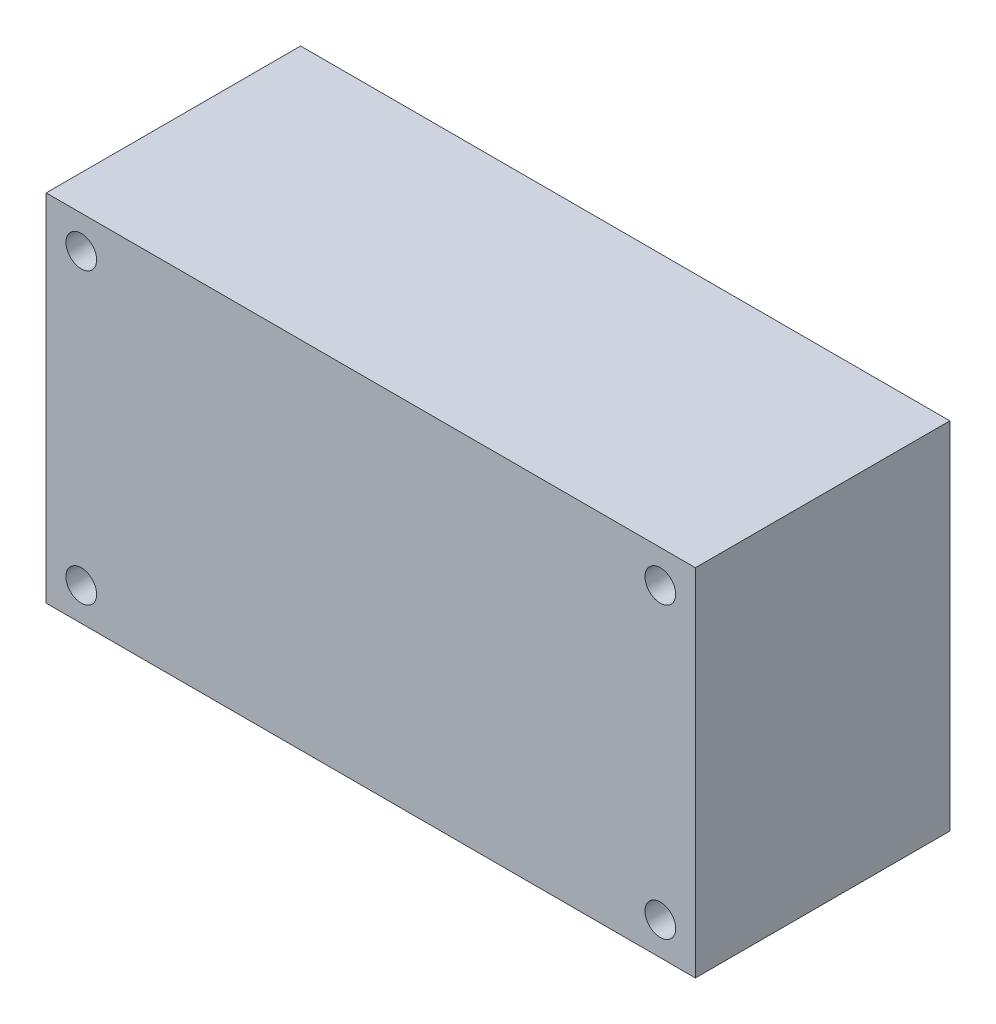
ISO-10303-21;
HEADER;
FILE_DESCRIPTION(('STEP AP214'),'2;1');
FILE_NAME('part.step','',(''),(''),'','','');
FILE_SCHEMA(('AUTOMOTIVE_DESIGN { 1 0 10303 214 1 1 1 1 }'));
ENDSEC;
DATA;
#1=APPLICATION_CONTEXT('core data for automotive mechanical design processes');
#2=APPLICATION_PROTOCOL_DEFINITION('international standard','automotive_design',2000,#1);
#3=PRODUCT_CONTEXT('',#1,'mechanical');
#4=PRODUCT('Part','Part','',(#3));
#5=PRODUCT_RELATED_PRODUCT_CATEGORY('part','',(#4));
#6=PRODUCT_DEFINITION_FORMATION('','',#4);
#7=PRODUCT_DEFINITION_CONTEXT('part definition',#1,'design');
#8=PRODUCT_DEFINITION('design','',#6,#7);
#9=PRODUCT_DEFINITION_SHAPE('','',#8);
#10=(LENGTH_UNIT() NAMED_UNIT(*) SI_UNIT(.MILLI.,.METRE.));
#11=(NAMED_UNIT(*) PLANE_ANGLE_UNIT() SI_UNIT($,.RADIAN.));
#12=(NAMED_UNIT(*) SI_UNIT($,.STERADIAN.) SOLID_ANGLE_UNIT());
#13=UNCERTAINTY_MEASURE_WITH_UNIT(LENGTH_MEASURE(1.E-05),#10,'distance_accuracy_value','');
#14=(GEOMETRIC_REPRESENTATION_CONTEXT(3) GLOBAL_UNCERTAINTY_ASSIGNED_CONTEXT((#13)) GLOBAL_UNIT_ASSIGNED_CONTEXT((#10,
#11,#12)) REPRESENTATION_CONTEXT('',''));
#15=CARTESIAN_POINT('',(0.,0.,0.));
#16=DIRECTION('',(0.,0.,1.));
#17=DIRECTION('',(1.,0.,0.));
#18=AXIS2_PLACEMENT_3D('',#15,#16,#17);
#19=CARTESIAN_POINT('',(37.,-20.25,29.));
#20=DIRECTION('',(0.,0.,1.));
#21=DIRECTION('',(1.,0.,0.));
#22=AXIS2_PLACEMENT_3D('',#19,#20,#21);
#23=PLANE('',#22);
#24=CARTESIAN_POINT('',(33.,-16.5,29.));
#25=DIRECTION('',(0.,0.,1.));
#26=DIRECTION('',(1.,0.,0.));
#27=AXIS2_PLACEMENT_3D('',#24,#25,#26);
#28=CIRCLE('',#27,1.75);
#29=CARTESIAN_POINT('',(31.25,-16.5,29.));
#30=VERTEX_POINT('',#29);
#31=EDGE_CURVE('E119',#30,#30,#28,.T.);
#32=ORIENTED_EDGE('',*,*,#31,.F.);
#33=EDGE_LOOP('',(#32));
#34=FACE_BOUND('',#33,.T.);
#35=CARTESIAN_POINT('',(-33.,16.5,29.));
#36=DIRECTION('',(0.,0.,1.));
#37=DIRECTION('',(1.,0.,0.));
#38=AXIS2_PLACEMENT_3D('',#35,#36,#37);
#39=CIRCLE('',#38,1.75);
#40=CARTESIAN_POINT('',(-34.75,16.5,29.));
#41=VERTEX_POINT('',#40);
#42=EDGE_CURVE('E98',#41,#41,#39,.T.);
#43=ORIENTED_EDGE('',*,*,#42,.F.);
#44=EDGE_LOOP('',(#43));
#45=FACE_BOUND('',#44,.T.);
#46=DIRECTION('',(0.,1.,0.));
#47=VECTOR('',#46,1.);
#48=CARTESIAN_POINT('',(37.,20.25,29.));
#49=LINE('',#48,#47);
#50=CARTESIAN_POINT('',(37.,-20.25,29.));
#51=VERTEX_POINT('',#50);
#52=CARTESIAN_POINT('',(37.,20.25,29.));
#53=VERTEX_POINT('',#52);
#54=EDGE_CURVE('E83',#51,#53,#49,.T.);
#55=ORIENTED_EDGE('',*,*,#54,.T.);
#56=DIRECTION('',(-1.,0.,0.));
#57=VECTOR('',#56,1.);
#58=CARTESIAN_POINT('',(-37.,20.25,29.));
#59=LINE('',#58,#57);
#60=CARTESIAN_POINT('',(-37.,20.25,29.));
#61=VERTEX_POINT('',#60);
#62=EDGE_CURVE('E78',#53,#61,#59,.T.);
#63=ORIENTED_EDGE('',*,*,#62,.T.);
#64=DIRECTION('',(0.,-1.,0.));
#65=VECTOR('',#64,1.);
#66=CARTESIAN_POINT('',(-37.,20.25,29.));
#67=LINE('',#66,#65);
#68=CARTESIAN_POINT('',(-37.,-20.25,29.));
#69=VERTEX_POINT('',#68);
#70=EDGE_CURVE('E81',#61,#69,#67,.T.);
#71=ORIENTED_EDGE('',*,*,#70,.T.);
#72=DIRECTION('',(1.,0.,0.));
#73=VECTOR('',#72,1.);
#74=CARTESIAN_POINT('',(-37.,-20.25,29.));
#75=LINE('',#74,#73);
#76=EDGE_CURVE('E48',#69,#51,#75,.T.);
#77=ORIENTED_EDGE('',*,*,#76,.T.);
#78=EDGE_LOOP('',(#55,#63,#71,#77));
#79=FACE_BOUND('',#78,.T.);
#80=CARTESIAN_POINT('',(-33.,-16.5,29.));
#81=DIRECTION('',(0.,0.,1.));
#82=DIRECTION('',(1.,0.,0.));
#83=AXIS2_PLACEMENT_3D('',#80,#81,#82);
#84=CIRCLE('',#83,1.75);
#85=CARTESIAN_POINT('',(-34.75,-16.5,29.));
#86=VERTEX_POINT('',#85);
#87=EDGE_CURVE('E113',#86,#86,#84,.T.);
#88=ORIENTED_EDGE('',*,*,#87,.F.);
#89=EDGE_LOOP('',(#88));
#90=FACE_BOUND('',#89,.T.);
#91=CARTESIAN_POINT('',(33.,16.5,29.));
#92=DIRECTION('',(0.,0.,1.));
#93=DIRECTION('',(1.,0.,0.));
#94=AXIS2_PLACEMENT_3D('',#91,#92,#93);
#95=CIRCLE('',#94,1.75);
#96=CARTESIAN_POINT('',(31.25,16.5,29.));
#97=VERTEX_POINT('',#96);
#98=EDGE_CURVE('E125',#97,#97,#95,.T.);
#99=ORIENTED_EDGE('',*,*,#98,.F.);
#100=EDGE_LOOP('',(#99));
#101=FACE_BOUND('',#100,.T.);
#102=ADVANCED_FACE('F31',(#34,#45,#79,#90,#101),#23,.T.);
#103=CARTESIAN_POINT('',(37.,-20.25,0.));
#104=DIRECTION('',(0.,0.,1.));
#105=DIRECTION('',(1.,0.,0.));
#106=AXIS2_PLACEMENT_3D('',#103,#104,#105);
#107=PLANE('',#106);
#108=CARTESIAN_POINT('',(33.,-16.5,0.));
#109=DIRECTION('',(0.,0.,1.));
#110=DIRECTION('',(1.,0.,0.));
#111=AXIS2_PLACEMENT_3D('',#108,#109,#110);
#112=CIRCLE('',#111,1.75);
#113=CARTESIAN_POINT('',(31.25,-16.5,0.));
#114=VERTEX_POINT('',#113);
#115=EDGE_CURVE('E122',#114,#114,#112,.T.);
#116=ORIENTED_EDGE('',*,*,#115,.T.);
#117=EDGE_LOOP('',(#116));
#118=FACE_BOUND('',#117,.T.);
#119=CARTESIAN_POINT('',(-33.,16.5,0.));
#120=DIRECTION('',(0.,0.,1.));
#121=DIRECTION('',(1.,0.,0.));
#122=AXIS2_PLACEMENT_3D('',#119,#120,#121);
#123=CIRCLE('',#122,1.75);
#124=CARTESIAN_POINT('',(-34.75,16.5,0.));
#125=VERTEX_POINT('',#124);
#126=EDGE_CURVE('E110',#125,#125,#123,.T.);
#127=ORIENTED_EDGE('',*,*,#126,.T.);
#128=EDGE_LOOP('',(#127));
#129=FACE_BOUND('',#128,.T.);
#130=DIRECTION('',(0.,1.,0.));
#131=VECTOR('',#130,1.);
#132=CARTESIAN_POINT('',(37.,20.25,0.));
#133=LINE('',#132,#131);
#134=CARTESIAN_POINT('',(37.,-20.25,0.));
#135=VERTEX_POINT('',#134);
#136=CARTESIAN_POINT('',(37.,20.25,0.));
#137=VERTEX_POINT('',#136);
#138=EDGE_CURVE('E95',#135,#137,#133,.T.);
#139=ORIENTED_EDGE('',*,*,#138,.F.);
#140=DIRECTION('',(1.,0.,0.));
#141=VECTOR('',#140,1.);
#142=CARTESIAN_POINT('',(-37.,-20.25,0.));
#143=LINE('',#142,#141);
#144=CARTESIAN_POINT('',(-37.,-20.25,0.));
#145=VERTEX_POINT('',#144);
#146=EDGE_CURVE('E71',#145,#135,#143,.T.);
#147=ORIENTED_EDGE('',*,*,#146,.F.);
#148=DIRECTION('',(0.,-1.,0.));
#149=VECTOR('',#148,1.);
#150=CARTESIAN_POINT('',(-37.,20.25,0.));
#151=LINE('',#150,#149);
#152=CARTESIAN_POINT('',(-37.,20.25,0.));
#153=VERTEX_POINT('',#152);
#154=EDGE_CURVE('E65',#153,#145,#151,.T.);
#155=ORIENTED_EDGE('',*,*,#154,.F.);
#156=DIRECTION('',(-1.,0.,0.));
#157=VECTOR('',#156,1.);
#158=CARTESIAN_POINT('',(-37.,20.25,0.));
#159=LINE('',#158,#157);
#160=EDGE_CURVE('E87',#137,#153,#159,.T.);
#161=ORIENTED_EDGE('',*,*,#160,.F.);
#162=EDGE_LOOP('',(#139,#147,#155,#161));
#163=FACE_BOUND('',#162,.T.);
#164=CARTESIAN_POINT('',(-33.,-16.5,0.));
#165=DIRECTION('',(0.,0.,1.));
#166=DIRECTION('',(1.,0.,0.));
#167=AXIS2_PLACEMENT_3D('',#164,#165,#166);
#168=CIRCLE('',#167,1.75);
#169=CARTESIAN_POINT('',(-34.75,-16.5,0.));
#170=VERTEX_POINT('',#169);
#171=EDGE_CURVE('E116',#170,#170,#168,.T.);
#172=ORIENTED_EDGE('',*,*,#171,.T.);
#173=EDGE_LOOP('',(#172));
#174=FACE_BOUND('',#173,.T.);
#175=CARTESIAN_POINT('',(33.,16.5,0.));
#176=DIRECTION('',(0.,0.,1.));
#177=DIRECTION('',(1.,0.,0.));
#178=AXIS2_PLACEMENT_3D('',#175,#176,#177);
#179=CIRCLE('',#178,1.75);
#180=CARTESIAN_POINT('',(31.25,16.5,0.));
#181=VERTEX_POINT('',#180);
#182=EDGE_CURVE('E128',#181,#181,#179,.T.);
#183=ORIENTED_EDGE('',*,*,#182,.T.);
#184=EDGE_LOOP('',(#183));
#185=FACE_BOUND('',#184,.T.);
#186=ADVANCED_FACE('F106',(#118,#129,#163,#174,#185),#107,.F.);
#187=CARTESIAN_POINT('',(37.,20.25,29.));
#188=DIRECTION('',(-1.,0.,0.));
#189=DIRECTION('',(0.,-1.,0.));
#190=AXIS2_PLACEMENT_3D('',#187,#188,#189);
#191=PLANE('',#190);
#192=ORIENTED_EDGE('',*,*,#138,.T.);
#193=DIRECTION('',(0.,0.,-1.));
#194=VECTOR('',#193,1.);
#195=CARTESIAN_POINT('',(37.,20.25,29.));
#196=LINE('',#195,#194);
#197=EDGE_CURVE('E11',#53,#137,#196,.T.);
#198=ORIENTED_EDGE('',*,*,#197,.F.);
#199=ORIENTED_EDGE('',*,*,#54,.F.);
#200=DIRECTION('',(0.,0.,-1.));
#201=VECTOR('',#200,1.);
#202=CARTESIAN_POINT('',(37.,-20.25,29.));
#203=LINE('',#202,#201);
#204=EDGE_CURVE('E91',#51,#135,#203,.T.);
#205=ORIENTED_EDGE('',*,*,#204,.T.);
#206=EDGE_LOOP('',(#192,#198,#199,#205));
#207=FACE_BOUND('',#206,.T.);
#208=ADVANCED_FACE('F33',(#207),#191,.F.);
#209=CARTESIAN_POINT('',(-37.,20.25,29.));
#210=DIRECTION('',(0.,-1.,0.));
#211=DIRECTION('',(0.,0.,-1.));
#212=AXIS2_PLACEMENT_3D('',#209,#210,#211);
#213=PLANE('',#212);
#214=ORIENTED_EDGE('',*,*,#160,.T.);
#215=DIRECTION('',(0.,0.,-1.));
#216=VECTOR('',#215,1.);
#217=CARTESIAN_POINT('',(-37.,20.25,29.));
#218=LINE('',#217,#216);
#219=EDGE_CURVE('E40',#61,#153,#218,.T.);
#220=ORIENTED_EDGE('',*,*,#219,.F.);
#221=ORIENTED_EDGE('',*,*,#62,.F.);
#222=ORIENTED_EDGE('',*,*,#197,.T.);
#223=EDGE_LOOP('',(#214,#220,#221,#222));
#224=FACE_BOUND('',#223,.T.);
#225=ADVANCED_FACE('F86',(#224),#213,.F.);
#226=CARTESIAN_POINT('',(-37.,20.25,29.));
#227=DIRECTION('',(1.,0.,0.));
#228=DIRECTION('',(0.,1.,0.));
#229=AXIS2_PLACEMENT_3D('',#226,#227,#228);
#230=PLANE('',#229);
#231=ORIENTED_EDGE('',*,*,#154,.T.);
#232=DIRECTION('',(0.,0.,-1.));
#233=VECTOR('',#232,1.);
#234=CARTESIAN_POINT('',(-37.,-20.25,29.));
#235=LINE('',#234,#233);
#236=EDGE_CURVE('E88',#69,#145,#235,.T.);
#237=ORIENTED_EDGE('',*,*,#236,.F.);
#238=ORIENTED_EDGE('',*,*,#70,.F.);
#239=ORIENTED_EDGE('',*,*,#219,.T.);
#240=EDGE_LOOP('',(#231,#237,#238,#239));
#241=FACE_BOUND('',#240,.T.);
#242=ADVANCED_FACE('F89',(#241),#230,.F.);
#243=CARTESIAN_POINT('',(-37.,-20.25,29.));
#244=DIRECTION('',(0.,1.,0.));
#245=DIRECTION('',(0.,0.,1.));
#246=AXIS2_PLACEMENT_3D('',#243,#244,#245);
#247=PLANE('',#246);
#248=ORIENTED_EDGE('',*,*,#146,.T.);
#249=ORIENTED_EDGE('',*,*,#204,.F.);
#250=ORIENTED_EDGE('',*,*,#76,.F.);
#251=ORIENTED_EDGE('',*,*,#236,.T.);
#252=EDGE_LOOP('',(#248,#249,#250,#251));
#253=FACE_BOUND('',#252,.T.);
#254=ADVANCED_FACE('F103',(#253),#247,.F.);
#255=CARTESIAN_POINT('',(-33.,16.5,29.));
#256=DIRECTION('',(0.,0.,-1.));
#257=DIRECTION('',(-1.,0.,0.));
#258=AXIS2_PLACEMENT_3D('',#255,#256,#257);
#259=CYLINDRICAL_SURFACE('',#258,1.75);
#260=CARTESIAN_POINT('',(-34.75,16.5,29.));
#261=CARTESIAN_POINT('',(-34.75,16.5,28.6979166666667));
#262=CARTESIAN_POINT('',(-34.75,16.5,28.3958333333333));
#263=CARTESIAN_POINT('',(-34.75,16.5,27.7916666666667));
#264=CARTESIAN_POINT('',(-34.75,16.5,27.4895833333333));
#265=CARTESIAN_POINT('',(-34.75,16.5,26.8854166666667));
#266=CARTESIAN_POINT('',(-34.75,16.5,26.5833333333333));
#267=CARTESIAN_POINT('',(-34.75,16.5,25.9791666666667));
#268=CARTESIAN_POINT('',(-34.75,16.5,25.6770833333333));
#269=CARTESIAN_POINT('',(-34.75,16.5,25.0729166666667));
#270=CARTESIAN_POINT('',(-34.75,16.5,24.7708333333333));
#271=CARTESIAN_POINT('',(-34.75,16.5,24.1666666666667));
#272=CARTESIAN_POINT('',(-34.75,16.5,23.8645833333333));
#273=CARTESIAN_POINT('',(-34.75,16.5,23.2604166666667));
#274=CARTESIAN_POINT('',(-34.75,16.5,22.9583333333333));
#275=CARTESIAN_POINT('',(-34.75,16.5,22.3541666666667));
#276=CARTESIAN_POINT('',(-34.75,16.5,22.0520833333333));
#277=CARTESIAN_POINT('',(-34.75,16.5,21.4479166666667));
#278=CARTESIAN_POINT('',(-34.75,16.5,21.1458333333333));
#279=CARTESIAN_POINT('',(-34.75,16.5,20.5416666666667));
#280=CARTESIAN_POINT('',(-34.75,16.5,20.2395833333333));
#281=CARTESIAN_POINT('',(-34.75,16.5,19.6354166666667));
#282=CARTESIAN_POINT('',(-34.75,16.5,19.3333333333333));
#283=CARTESIAN_POINT('',(-34.75,16.5,18.7291666666667));
#284=CARTESIAN_POINT('',(-34.75,16.5,18.4270833333333));
#285=CARTESIAN_POINT('',(-34.75,16.5,17.8229166666667));
#286=CARTESIAN_POINT('',(-34.75,16.5,17.5208333333333));
#287=CARTESIAN_POINT('',(-34.75,16.5,16.9166666666667));
#288=CARTESIAN_POINT('',(-34.75,16.5,16.6145833333333));
#289=CARTESIAN_POINT('',(-34.75,16.5,16.0104166666667));
#290=CARTESIAN_POINT('',(-34.75,16.5,15.7083333333333));
#291=CARTESIAN_POINT('',(-34.75,16.5,15.1041666666667));
#292=CARTESIAN_POINT('',(-34.75,16.5,14.8020833333333));
#293=CARTESIAN_POINT('',(-34.75,16.5,14.1979166666667));
#294=CARTESIAN_POINT('',(-34.75,16.5,13.8958333333333));
#295=CARTESIAN_POINT('',(-34.75,16.5,13.2916666666667));
#296=CARTESIAN_POINT('',(-34.75,16.5,12.9895833333333));
#297=CARTESIAN_POINT('',(-34.75,16.5,12.3854166666667));
#298=CARTESIAN_POINT('',(-34.75,16.5,12.0833333333333));
#299=CARTESIAN_POINT('',(-34.75,16.5,11.4791666666667));
#300=CARTESIAN_POINT('',(-34.75,16.5,11.1770833333333));
#301=CARTESIAN_POINT('',(-34.75,16.5,10.5729166666667));
#302=CARTESIAN_POINT('',(-34.75,16.5,10.2708333333333));
#303=CARTESIAN_POINT('',(-34.75,16.5,9.66666666666667));
#304=CARTESIAN_POINT('',(-34.75,16.5,9.36458333333333));
#305=CARTESIAN_POINT('',(-34.75,16.5,8.76041666666667));
#306=CARTESIAN_POINT('',(-34.75,16.5,8.45833333333333));
#307=CARTESIAN_POINT('',(-34.75,16.5,7.85416666666667));
#308=CARTESIAN_POINT('',(-34.75,16.5,7.55208333333333));
#309=CARTESIAN_POINT('',(-34.75,16.5,6.94791666666667));
#310=CARTESIAN_POINT('',(-34.75,16.5,6.64583333333333));
#311=CARTESIAN_POINT('',(-34.75,16.5,6.04166666666667));
#312=CARTESIAN_POINT('',(-34.75,16.5,5.73958333333333));
#313=CARTESIAN_POINT('',(-34.75,16.5,5.13541666666667));
#314=CARTESIAN_POINT('',(-34.75,16.5,4.83333333333333));
#315=CARTESIAN_POINT('',(-34.75,16.5,4.22916666666667));
#316=CARTESIAN_POINT('',(-34.75,16.5,3.92708333333333));
#317=CARTESIAN_POINT('',(-34.75,16.5,3.32291666666667));
#318=CARTESIAN_POINT('',(-34.75,16.5,3.02083333333333));
#319=CARTESIAN_POINT('',(-34.75,16.5,2.41666666666667));
#320=CARTESIAN_POINT('',(-34.75,16.5,2.11458333333333));
#321=CARTESIAN_POINT('',(-34.75,16.5,1.51041666666667));
#322=CARTESIAN_POINT('',(-34.75,16.5,1.20833333333333));
#323=CARTESIAN_POINT('',(-34.75,16.5,0.604166666666667));
#324=CARTESIAN_POINT('',(-34.75,16.5,0.302083333333333));
#325=CARTESIAN_POINT('',(-34.75,16.5,0.));
#326=B_SPLINE_CURVE_WITH_KNOTS('',3,(#260,#261,#262,#263,#264,#265,#266,#267,#268,#269,#270,
#271,#272,#273,#274,#275,#276,#277,#278,#279,#280,#281,#282,#283,#284,#285,#286,#287,#288,#289,
#290,#291,#292,#293,#294,#295,#296,#297,#298,#299,#300,#301,#302,#303,#304,#305,#306,#307,#308,
#309,#310,#311,#312,#313,#314,#315,#316,#317,#318,#319,#320,#321,#322,#323,#324,#325),
.UNSPECIFIED.,.F.,.F.,(4,2,2,2,2,2,2,2,2,2,2,2,2,2,2,2,2,2,2,2,2,2,2,2,2,2,2,2,2,2,2,2,4),(0.,
0.906250000000001,1.8125,2.71875,3.625,4.53125,5.4375,6.34375,7.25,8.15625,9.0625,9.96875,
10.875,11.78125,12.6875,13.59375,14.5,15.40625,16.3125,17.21875,18.125,19.03125,19.9375,
20.84375,21.75,22.65625,23.5625,24.46875,25.375,26.28125,27.1875,28.09375,29.),.UNSPECIFIED.);
#327=EDGE_CURVE('BSEAM148',#41,#125,#326,.T.);
#328=ORIENTED_EDGE('',*,*,#42,.T.);
#329=ORIENTED_EDGE('',*,*,#126,.F.);
#330=ORIENTED_EDGE('',*,*,#327,.T.);
#331=ORIENTED_EDGE('',*,*,#327,.F.);
#332=EDGE_LOOP('',(#328,#330,#329,#331));
#333=FACE_BOUND('',#332,.T.);
#334=ADVANCED_FACE('F148',(#333),#259,.F.);
#335=CARTESIAN_POINT('',(-33.,-16.5,29.));
#336=DIRECTION('',(0.,0.,-1.));
#337=DIRECTION('',(-1.,0.,0.));
#338=AXIS2_PLACEMENT_3D('',#335,#336,#337);
#339=CYLINDRICAL_SURFACE('',#338,1.75);
#340=CARTESIAN_POINT('',(-34.75,-16.5,29.));
#341=CARTESIAN_POINT('',(-34.75,-16.5,28.6979166666667));
#342=CARTESIAN_POINT('',(-34.75,-16.5,28.3958333333333));
#343=CARTESIAN_POINT('',(-34.75,-16.5,27.7916666666667));
#344=CARTESIAN_POINT('',(-34.75,-16.5,27.4895833333333));
#345=CARTESIAN_POINT('',(-34.75,-16.5,26.8854166666667));
#346=CARTESIAN_POINT('',(-34.75,-16.5,26.5833333333333));
#347=CARTESIAN_POINT('',(-34.75,-16.5,25.9791666666667));
#348=CARTESIAN_POINT('',(-34.75,-16.5,25.6770833333333));
#349=CARTESIAN_POINT('',(-34.75,-16.5,25.0729166666667));
#350=CARTESIAN_POINT('',(-34.75,-16.5,24.7708333333333));
#351=CARTESIAN_POINT('',(-34.75,-16.5,24.1666666666667));
#352=CARTESIAN_POINT('',(-34.75,-16.5,23.8645833333333));
#353=CARTESIAN_POINT('',(-34.75,-16.5,23.2604166666667));
#354=CARTESIAN_POINT('',(-34.75,-16.5,22.9583333333333));
#355=CARTESIAN_POINT('',(-34.75,-16.5,22.3541666666667));
#356=CARTESIAN_POINT('',(-34.75,-16.5,22.0520833333333));
#357=CARTESIAN_POINT('',(-34.75,-16.5,21.4479166666667));
#358=CARTESIAN_POINT('',(-34.75,-16.5,21.1458333333333));
#359=CARTESIAN_POINT('',(-34.75,-16.5,20.5416666666667));
#360=CARTESIAN_POINT('',(-34.75,-16.5,20.2395833333333));
#361=CARTESIAN_POINT('',(-34.75,-16.5,19.6354166666667));
#362=CARTESIAN_POINT('',(-34.75,-16.5,19.3333333333333));
#363=CARTESIAN_POINT('',(-34.75,-16.5,18.7291666666667));
#364=CARTESIAN_POINT('',(-34.75,-16.5,18.4270833333333));
#365=CARTESIAN_POINT('',(-34.75,-16.5,17.8229166666667));
#366=CARTESIAN_POINT('',(-34.75,-16.5,17.5208333333333));
#367=CARTESIAN_POINT('',(-34.75,-16.5,16.9166666666667));
#368=CARTESIAN_POINT('',(-34.75,-16.5,16.6145833333333));
#369=CARTESIAN_POINT('',(-34.75,-16.5,16.0104166666667));
#370=CARTESIAN_POINT('',(-34.75,-16.5,15.7083333333333));
#371=CARTESIAN_POINT('',(-34.75,-16.5,15.1041666666667));
#372=CARTESIAN_POINT('',(-34.75,-16.5,14.8020833333333));
#373=CARTESIAN_POINT('',(-34.75,-16.5,14.1979166666667));
#374=CARTESIAN_POINT('',(-34.75,-16.5,13.8958333333333));
#375=CARTESIAN_POINT('',(-34.75,-16.5,13.2916666666667));
#376=CARTESIAN_POINT('',(-34.75,-16.5,12.9895833333333));
#377=CARTESIAN_POINT('',(-34.75,-16.5,12.3854166666667));
#378=CARTESIAN_POINT('',(-34.75,-16.5,12.0833333333333));
#379=CARTESIAN_POINT('',(-34.75,-16.5,11.4791666666667));
#380=CARTESIAN_POINT('',(-34.75,-16.5,11.1770833333333));
#381=CARTESIAN_POINT('',(-34.75,-16.5,10.5729166666667));
#382=CARTESIAN_POINT('',(-34.75,-16.5,10.2708333333333));
#383=CARTESIAN_POINT('',(-34.75,-16.5,9.66666666666667));
#384=CARTESIAN_POINT('',(-34.75,-16.5,9.36458333333333));
#385=CARTESIAN_POINT('',(-34.75,-16.5,8.76041666666667));
#386=CARTESIAN_POINT('',(-34.75,-16.5,8.45833333333333));
#387=CARTESIAN_POINT('',(-34.75,-16.5,7.85416666666667));
#388=CARTESIAN_POINT('',(-34.75,-16.5,7.55208333333333));
#389=CARTESIAN_POINT('',(-34.75,-16.5,6.94791666666667));
#390=CARTESIAN_POINT('',(-34.75,-16.5,6.64583333333333));
#391=CARTESIAN_POINT('',(-34.75,-16.5,6.04166666666667));
#392=CARTESIAN_POINT('',(-34.75,-16.5,5.73958333333333));
#393=CARTESIAN_POINT('',(-34.75,-16.5,5.13541666666667));
#394=CARTESIAN_POINT('',(-34.75,-16.5,4.83333333333333));
#395=CARTESIAN_POINT('',(-34.75,-16.5,4.22916666666667));
#396=CARTESIAN_POINT('',(-34.75,-16.5,3.92708333333333));
#397=CARTESIAN_POINT('',(-34.75,-16.5,3.32291666666667));
#398=CARTESIAN_POINT('',(-34.75,-16.5,3.02083333333333));
#399=CARTESIAN_POINT('',(-34.75,-16.5,2.41666666666667));
#400=CARTESIAN_POINT('',(-34.75,-16.5,2.11458333333333));
#401=CARTESIAN_POINT('',(-34.75,-16.5,1.51041666666667));
#402=CARTESIAN_POINT('',(-34.75,-16.5,1.20833333333333));
#403=CARTESIAN_POINT('',(-34.75,-16.5,0.604166666666667));
#404=CARTESIAN_POINT('',(-34.75,-16.5,0.302083333333333));
#405=CARTESIAN_POINT('',(-34.75,-16.5,0.));
#406=B_SPLINE_CURVE_WITH_KNOTS('',3,(#340,#341,#342,#343,#344,#345,#346,#347,#348,#349,#350,
#351,#352,#353,#354,#355,#356,#357,#358,#359,#360,#361,#362,#363,#364,#365,#366,#367,#368,#369,
#370,#371,#372,#373,#374,#375,#376,#377,#378,#379,#380,#381,#382,#383,#384,#385,#386,#387,#388,
#389,#390,#391,#392,#393,#394,#395,#396,#397,#398,#399,#400,#401,#402,#403,#404,#405),
.UNSPECIFIED.,.F.,.F.,(4,2,2,2,2,2,2,2,2,2,2,2,2,2,2,2,2,2,2,2,2,2,2,2,2,2,2,2,2,2,2,2,4),(0.,
0.906250000000001,1.8125,2.71875,3.625,4.53125,5.4375,6.34375,7.25,8.15625,9.0625,9.96875,
10.875,11.78125,12.6875,13.59375,14.5,15.40625,16.3125,17.21875,18.125,19.03125,19.9375,
20.84375,21.75,22.65625,23.5625,24.46875,25.375,26.28125,27.1875,28.09375,29.),.UNSPECIFIED.);
#407=EDGE_CURVE('BSEAM194',#86,#170,#406,.T.);
#408=ORIENTED_EDGE('',*,*,#87,.T.);
#409=ORIENTED_EDGE('',*,*,#171,.F.);
#410=ORIENTED_EDGE('',*,*,#407,.T.);
#411=ORIENTED_EDGE('',*,*,#407,.F.);
#412=EDGE_LOOP('',(#408,#410,#409,#411));
#413=FACE_BOUND('',#412,.T.);
#414=ADVANCED_FACE('F194',(#413),#339,.F.);
#415=CARTESIAN_POINT('',(33.,-16.5,29.));
#416=DIRECTION('',(0.,0.,-1.));
#417=DIRECTION('',(-1.,0.,0.));
#418=AXIS2_PLACEMENT_3D('',#415,#416,#417);
#419=CYLINDRICAL_SURFACE('',#418,1.75);
#420=CARTESIAN_POINT('',(31.25,-16.5,29.));
#421=CARTESIAN_POINT('',(31.25,-16.5,28.6979166666667));
#422=CARTESIAN_POINT('',(31.25,-16.5,28.3958333333333));
#423=CARTESIAN_POINT('',(31.25,-16.5,27.7916666666667));
#424=CARTESIAN_POINT('',(31.25,-16.5,27.4895833333333));
#425=CARTESIAN_POINT('',(31.25,-16.5,26.8854166666667));
#426=CARTESIAN_POINT('',(31.25,-16.5,26.5833333333333));
#427=CARTESIAN_POINT('',(31.25,-16.5,25.9791666666667));
#428=CARTESIAN_POINT('',(31.25,-16.5,25.6770833333333));
#429=CARTESIAN_POINT('',(31.25,-16.5,25.0729166666667));
#430=CARTESIAN_POINT('',(31.25,-16.5,24.7708333333333));
#431=CARTESIAN_POINT('',(31.25,-16.5,24.1666666666667));
#432=CARTESIAN_POINT('',(31.25,-16.5,23.8645833333333));
#433=CARTESIAN_POINT('',(31.25,-16.5,23.2604166666667));
#434=CARTESIAN_POINT('',(31.25,-16.5,22.9583333333333));
#435=CARTESIAN_POINT('',(31.25,-16.5,22.3541666666667));
#436=CARTESIAN_POINT('',(31.25,-16.5,22.0520833333333));
#437=CARTESIAN_POINT('',(31.25,-16.5,21.4479166666667));
#438=CARTESIAN_POINT('',(31.25,-16.5,21.1458333333333));
#439=CARTESIAN_POINT('',(31.25,-16.5,20.5416666666667));
#440=CARTESIAN_POINT('',(31.25,-16.5,20.2395833333333));
#441=CARTESIAN_POINT('',(31.25,-16.5,19.6354166666667));
#442=CARTESIAN_POINT('',(31.25,-16.5,19.3333333333333));
#443=CARTESIAN_POINT('',(31.25,-16.5,18.7291666666667));
#444=CARTESIAN_POINT('',(31.25,-16.5,18.4270833333333));
#445=CARTESIAN_POINT('',(31.25,-16.5,17.8229166666667));
#446=CARTESIAN_POINT('',(31.25,-16.5,17.5208333333333));
#447=CARTESIAN_POINT('',(31.25,-16.5,16.9166666666667));
#448=CARTESIAN_POINT('',(31.25,-16.5,16.6145833333333));
#449=CARTESIAN_POINT('',(31.25,-16.5,16.0104166666667));
#450=CARTESIAN_POINT('',(31.25,-16.5,15.7083333333333));
#451=CARTESIAN_POINT('',(31.25,-16.5,15.1041666666667));
#452=CARTESIAN_POINT('',(31.25,-16.5,14.8020833333333));
#453=CARTESIAN_POINT('',(31.25,-16.5,14.1979166666667));
#454=CARTESIAN_POINT('',(31.25,-16.5,13.8958333333333));
#455=CARTESIAN_POINT('',(31.25,-16.5,13.2916666666667));
#456=CARTESIAN_POINT('',(31.25,-16.5,12.9895833333333));
#457=CARTESIAN_POINT('',(31.25,-16.5,12.3854166666667));
#458=CARTESIAN_POINT('',(31.25,-16.5,12.0833333333333));
#459=CARTESIAN_POINT('',(31.25,-16.5,11.4791666666667));
#460=CARTESIAN_POINT('',(31.25,-16.5,11.1770833333333));
#461=CARTESIAN_POINT('',(31.25,-16.5,10.5729166666667));
#462=CARTESIAN_POINT('',(31.25,-16.5,10.2708333333333));
#463=CARTESIAN_POINT('',(31.25,-16.5,9.66666666666667));
#464=CARTESIAN_POINT('',(31.25,-16.5,9.36458333333333));
#465=CARTESIAN_POINT('',(31.25,-16.5,8.76041666666667));
#466=CARTESIAN_POINT('',(31.25,-16.5,8.45833333333333));
#467=CARTESIAN_POINT('',(31.25,-16.5,7.85416666666667));
#468=CARTESIAN_POINT('',(31.25,-16.5,7.55208333333333));
#469=CARTESIAN_POINT('',(31.25,-16.5,6.94791666666667));
#470=CARTESIAN_POINT('',(31.25,-16.5,6.64583333333333));
#471=CARTESIAN_POINT('',(31.25,-16.5,6.04166666666667));
#472=CARTESIAN_POINT('',(31.25,-16.5,5.73958333333333));
#473=CARTESIAN_POINT('',(31.25,-16.5,5.13541666666667));
#474=CARTESIAN_POINT('',(31.25,-16.5,4.83333333333333));
#475=CARTESIAN_POINT('',(31.25,-16.5,4.22916666666667));
#476=CARTESIAN_POINT('',(31.25,-16.5,3.92708333333333));
#477=CARTESIAN_POINT('',(31.25,-16.5,3.32291666666667));
#478=CARTESIAN_POINT('',(31.25,-16.5,3.02083333333333));
#479=CARTESIAN_POINT('',(31.25,-16.5,2.41666666666667));
#480=CARTESIAN_POINT('',(31.25,-16.5,2.11458333333333));
#481=CARTESIAN_POINT('',(31.25,-16.5,1.51041666666667));
#482=CARTESIAN_POINT('',(31.25,-16.5,1.20833333333333));
#483=CARTESIAN_POINT('',(31.25,-16.5,0.604166666666667));
#484=CARTESIAN_POINT('',(31.25,-16.5,0.302083333333333));
#485=CARTESIAN_POINT('',(31.25,-16.5,0.));
#486=B_SPLINE_CURVE_WITH_KNOTS('',3,(#420,#421,#422,#423,#424,#425,#426,#427,#428,#429,#430,
#431,#432,#433,#434,#435,#436,#437,#438,#439,#440,#441,#442,#443,#444,#445,#446,#447,#448,#449,
#450,#451,#452,#453,#454,#455,#456,#457,#458,#459,#460,#461,#462,#463,#464,#465,#466,#467,#468,
#469,#470,#471,#472,#473,#474,#475,#476,#477,#478,#479,#480,#481,#482,#483,#484,#485),
.UNSPECIFIED.,.F.,.F.,(4,2,2,2,2,2,2,2,2,2,2,2,2,2,2,2,2,2,2,2,2,2,2,2,2,2,2,2,2,2,2,2,4),(0.,
0.906250000000001,1.8125,2.71875,3.625,4.53125,5.4375,6.34375,7.25,8.15625,9.0625,9.96875,
10.875,11.78125,12.6875,13.59375,14.5,15.40625,16.3125,17.21875,18.125,19.03125,19.9375,
20.84375,21.75,22.65625,23.5625,24.46875,25.375,26.28125,27.1875,28.09375,29.),.UNSPECIFIED.);
#487=EDGE_CURVE('BSEAM202',#30,#114,#486,.T.);
#488=ORIENTED_EDGE('',*,*,#31,.T.);
#489=ORIENTED_EDGE('',*,*,#115,.F.);
#490=ORIENTED_EDGE('',*,*,#487,.T.);
#491=ORIENTED_EDGE('',*,*,#487,.F.);
#492=EDGE_LOOP('',(#488,#490,#489,#491));
#493=FACE_BOUND('',#492,.T.);
#494=ADVANCED_FACE('F202',(#493),#419,.F.);
#495=CARTESIAN_POINT('',(33.,16.5,29.));
#496=DIRECTION('',(0.,0.,-1.));
#497=DIRECTION('',(-1.,0.,0.));
#498=AXIS2_PLACEMENT_3D('',#495,#496,#497);
#499=CYLINDRICAL_SURFACE('',#498,1.75);
#500=CARTESIAN_POINT('',(31.25,16.5,29.));
#501=CARTESIAN_POINT('',(31.25,16.5,28.6979166666667));
#502=CARTESIAN_POINT('',(31.25,16.5,28.3958333333333));
#503=CARTESIAN_POINT('',(31.25,16.5,27.7916666666667));
#504=CARTESIAN_POINT('',(31.25,16.5,27.4895833333333));
#505=CARTESIAN_POINT('',(31.25,16.5,26.8854166666667));
#506=CARTESIAN_POINT('',(31.25,16.5,26.5833333333333));
#507=CARTESIAN_POINT('',(31.25,16.5,25.9791666666667));
#508=CARTESIAN_POINT('',(31.25,16.5,25.6770833333333));
#509=CARTESIAN_POINT('',(31.25,16.5,25.0729166666667));
#510=CARTESIAN_POINT('',(31.25,16.5,24.7708333333333));
#511=CARTESIAN_POINT('',(31.25,16.5,24.1666666666667));
#512=CARTESIAN_POINT('',(31.25,16.5,23.8645833333333));
#513=CARTESIAN_POINT('',(31.25,16.5,23.2604166666667));
#514=CARTESIAN_POINT('',(31.25,16.5,22.9583333333333));
#515=CARTESIAN_POINT('',(31.25,16.5,22.3541666666667));
#516=CARTESIAN_POINT('',(31.25,16.5,22.0520833333333));
#517=CARTESIAN_POINT('',(31.25,16.5,21.4479166666667));
#518=CARTESIAN_POINT('',(31.25,16.5,21.1458333333333));
#519=CARTESIAN_POINT('',(31.25,16.5,20.5416666666667));
#520=CARTESIAN_POINT('',(31.25,16.5,20.2395833333333));
#521=CARTESIAN_POINT('',(31.25,16.5,19.6354166666667));
#522=CARTESIAN_POINT('',(31.25,16.5,19.3333333333333));
#523=CARTESIAN_POINT('',(31.25,16.5,18.7291666666667));
#524=CARTESIAN_POINT('',(31.25,16.5,18.4270833333333));
#525=CARTESIAN_POINT('',(31.25,16.5,17.8229166666667));
#526=CARTESIAN_POINT('',(31.25,16.5,17.5208333333333));
#527=CARTESIAN_POINT('',(31.25,16.5,16.9166666666667));
#528=CARTESIAN_POINT('',(31.25,16.5,16.6145833333333));
#529=CARTESIAN_POINT('',(31.25,16.5,16.0104166666667));
#530=CARTESIAN_POINT('',(31.25,16.5,15.7083333333333));
#531=CARTESIAN_POINT('',(31.25,16.5,15.1041666666667));
#532=CARTESIAN_POINT('',(31.25,16.5,14.8020833333333));
#533=CARTESIAN_POINT('',(31.25,16.5,14.1979166666667));
#534=CARTESIAN_POINT('',(31.25,16.5,13.8958333333333));
#535=CARTESIAN_POINT('',(31.25,16.5,13.2916666666667));
#536=CARTESIAN_POINT('',(31.25,16.5,12.9895833333333));
#537=CARTESIAN_POINT('',(31.25,16.5,12.3854166666667));
#538=CARTESIAN_POINT('',(31.25,16.5,12.0833333333333));
#539=CARTESIAN_POINT('',(31.25,16.5,11.4791666666667));
#540=CARTESIAN_POINT('',(31.25,16.5,11.1770833333333));
#541=CARTESIAN_POINT('',(31.25,16.5,10.5729166666667));
#542=CARTESIAN_POINT('',(31.25,16.5,10.2708333333333));
#543=CARTESIAN_POINT('',(31.25,16.5,9.66666666666667));
#544=CARTESIAN_POINT('',(31.25,16.5,9.36458333333333));
#545=CARTESIAN_POINT('',(31.25,16.5,8.76041666666667));
#546=CARTESIAN_POINT('',(31.25,16.5,8.45833333333333));
#547=CARTESIAN_POINT('',(31.25,16.5,7.85416666666667));
#548=CARTESIAN_POINT('',(31.25,16.5,7.55208333333333));
#549=CARTESIAN_POINT('',(31.25,16.5,6.94791666666667));
#550=CARTESIAN_POINT('',(31.25,16.5,6.64583333333333));
#551=CARTESIAN_POINT('',(31.25,16.5,6.04166666666667));
#552=CARTESIAN_POINT('',(31.25,16.5,5.73958333333333));
#553=CARTESIAN_POINT('',(31.25,16.5,5.13541666666667));
#554=CARTESIAN_POINT('',(31.25,16.5,4.83333333333333));
#555=CARTESIAN_POINT('',(31.25,16.5,4.22916666666667));
#556=CARTESIAN_POINT('',(31.25,16.5,3.92708333333333));
#557=CARTESIAN_POINT('',(31.25,16.5,3.32291666666667));
#558=CARTESIAN_POINT('',(31.25,16.5,3.02083333333333));
#559=CARTESIAN_POINT('',(31.25,16.5,2.41666666666667));
#560=CARTESIAN_POINT('',(31.25,16.5,2.11458333333333));
#561=CARTESIAN_POINT('',(31.25,16.5,1.51041666666667));
#562=CARTESIAN_POINT('',(31.25,16.5,1.20833333333333));
#563=CARTESIAN_POINT('',(31.25,16.5,0.604166666666667));
#564=CARTESIAN_POINT('',(31.25,16.5,0.302083333333333));
#565=CARTESIAN_POINT('',(31.25,16.5,0.));
#566=B_SPLINE_CURVE_WITH_KNOTS('',3,(#500,#501,#502,#503,#504,#505,#506,#507,#508,#509,#510,
#511,#512,#513,#514,#515,#516,#517,#518,#519,#520,#521,#522,#523,#524,#525,#526,#527,#528,#529,
#530,#531,#532,#533,#534,#535,#536,#537,#538,#539,#540,#541,#542,#543,#544,#545,#546,#547,#548,
#549,#550,#551,#552,#553,#554,#555,#556,#557,#558,#559,#560,#561,#562,#563,#564,#565),
.UNSPECIFIED.,.F.,.F.,(4,2,2,2,2,2,2,2,2,2,2,2,2,2,2,2,2,2,2,2,2,2,2,2,2,2,2,2,2,2,2,2,4),(0.,
0.906250000000001,1.8125,2.71875,3.625,4.53125,5.4375,6.34375,7.25,8.15625,9.0625,9.96875,
10.875,11.78125,12.6875,13.59375,14.5,15.40625,16.3125,17.21875,18.125,19.03125,19.9375,
20.84375,21.75,22.65625,23.5625,24.46875,25.375,26.28125,27.1875,28.09375,29.),.UNSPECIFIED.);
#567=EDGE_CURVE('BSEAM134',#97,#181,#566,.T.);
#568=ORIENTED_EDGE('',*,*,#98,.T.);
#569=ORIENTED_EDGE('',*,*,#182,.F.);
#570=ORIENTED_EDGE('',*,*,#567,.T.);
#571=ORIENTED_EDGE('',*,*,#567,.F.);
#572=EDGE_LOOP('',(#568,#570,#569,#571));
#573=FACE_BOUND('',#572,.T.);
#574=ADVANCED_FACE('F134',(#573),#499,.F.);
#575=CLOSED_SHELL('',(#102,#186,#208,#225,#242,#254,#334,#414,#494,#574));
#576=MANIFOLD_SOLID_BREP('B2',#575);
#577=ADVANCED_BREP_SHAPE_REPRESENTATION('',(#18,#576),#14);
#578=SHAPE_DEFINITION_REPRESENTATION(#9,#577);
ENDSEC;
END-ISO-10303-21;
